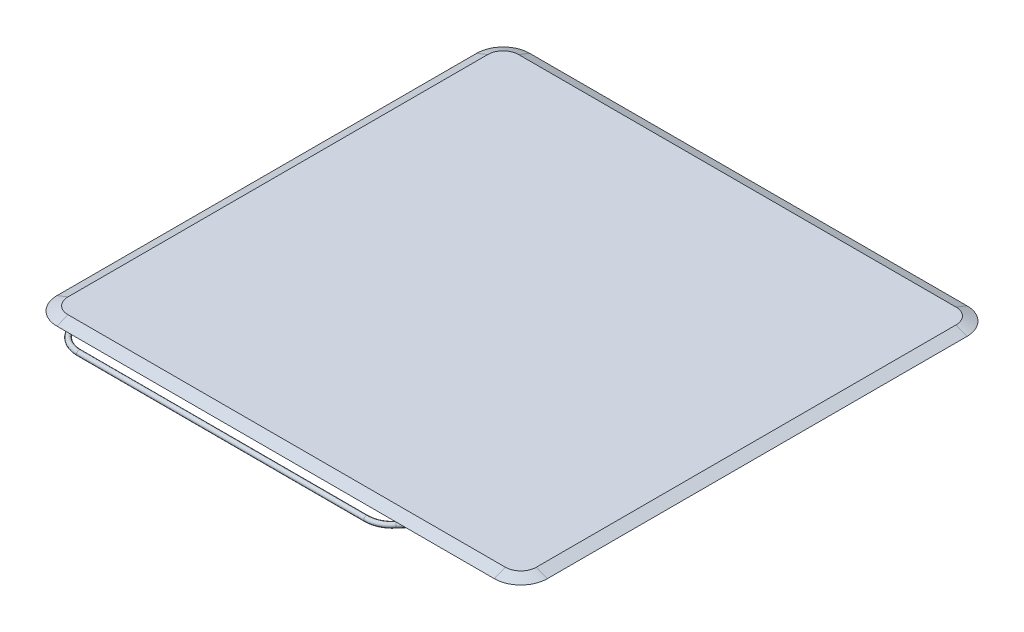
ISO-10303-21;
HEADER;
FILE_DESCRIPTION(('STEP AP214'),'2;1');
FILE_NAME('part.step','',(''),(''),'','','');
FILE_SCHEMA(('AUTOMOTIVE_DESIGN { 1 0 10303 214 1 1 1 1 }'));
ENDSEC;
DATA;
#1=APPLICATION_CONTEXT('core data for automotive mechanical design processes');
#2=APPLICATION_PROTOCOL_DEFINITION('international standard','automotive_design',2000,#1);
#3=PRODUCT_CONTEXT('',#1,'mechanical');
#4=PRODUCT('Part','Part','',(#3));
#5=PRODUCT_RELATED_PRODUCT_CATEGORY('part','',(#4));
#6=PRODUCT_DEFINITION_FORMATION('','',#4);
#7=PRODUCT_DEFINITION_CONTEXT('part definition',#1,'design');
#8=PRODUCT_DEFINITION('design','',#6,#7);
#9=PRODUCT_DEFINITION_SHAPE('','',#8);
#10=(LENGTH_UNIT() NAMED_UNIT(*) SI_UNIT(.MILLI.,.METRE.));
#11=(NAMED_UNIT(*) PLANE_ANGLE_UNIT() SI_UNIT($,.RADIAN.));
#12=(NAMED_UNIT(*) SI_UNIT($,.STERADIAN.) SOLID_ANGLE_UNIT());
#13=UNCERTAINTY_MEASURE_WITH_UNIT(LENGTH_MEASURE(1.E-05),#10,'distance_accuracy_value','');
#14=(GEOMETRIC_REPRESENTATION_CONTEXT(3) GLOBAL_UNCERTAINTY_ASSIGNED_CONTEXT((#13)) GLOBAL_UNIT_ASSIGNED_CONTEXT((#10,
#11,#12)) REPRESENTATION_CONTEXT('',''));
#15=CARTESIAN_POINT('',(0.,0.,0.));
#16=DIRECTION('',(0.,0.,1.));
#17=DIRECTION('',(1.,0.,0.));
#18=AXIS2_PLACEMENT_3D('',#15,#16,#17);
#19=CARTESIAN_POINT('',(0.,28.1999999999998,0.));
#20=DIRECTION('',(0.,1.,0.));
#21=DIRECTION('',(0.,0.,1.));
#22=AXIS2_PLACEMENT_3D('',#19,#20,#21);
#23=PLANE('',#22);
#24=DIRECTION('',(1.,0.,0.));
#25=VECTOR('',#24,1.);
#26=CARTESIAN_POINT('',(-49.5,28.2,51.));
#27=LINE('',#26,#25);
#28=CARTESIAN_POINT('',(49.5,28.2,51.));
#29=VERTEX_POINT('',#28);
#30=CARTESIAN_POINT('',(-49.5,28.2,51.));
#31=VERTEX_POINT('',#30);
#32=EDGE_CURVE('P0_E182',#29,#31,#27,.F.);
#33=ORIENTED_EDGE('',*,*,#32,.F.);
#34=CARTESIAN_POINT('',(49.5,28.2,51.));
#35=CARTESIAN_POINT('',(50.02138239889,28.2,51.));
#36=CARTESIAN_POINT('',(50.96242475965,28.2,50.77305553846));
#37=CARTESIAN_POINT('',(52.0284405267,28.2,50.0284405267));
#38=CARTESIAN_POINT('',(52.77305553846,28.2,48.96242475965));
#39=CARTESIAN_POINT('',(53.,28.2,48.02138239889));
#40=CARTESIAN_POINT('',(53.,28.2,47.5));
#41=B_SPLINE_CURVE_WITH_KNOTS('',3,(#34,#35,#36,#37,#38,#39,#40),.UNSPECIFIED.,.F.,.F.,(4,1,1,1,
4),(0.7547881540646,0.7592317860314,0.7636754179983,0.7681190499652,0.772562681932),.UNSPECIFIED.);
#42=CARTESIAN_POINT('',(52.9999999999997,28.1999999999991,47.5));
#43=VERTEX_POINT('',#42);
#44=EDGE_CURVE('P0_E201',#43,#29,#41,.F.);
#45=ORIENTED_EDGE('',*,*,#44,.F.);
#46=DIRECTION('',(0.,0.,1.));
#47=VECTOR('',#46,1.);
#48=CARTESIAN_POINT('',(53.,28.2,47.5));
#49=LINE('',#48,#47);
#50=CARTESIAN_POINT('',(53.,28.2,-47.5));
#51=VERTEX_POINT('',#50);
#52=EDGE_CURVE('P0_E82',#51,#43,#49,.T.);
#53=ORIENTED_EDGE('',*,*,#52,.F.);
#54=CARTESIAN_POINT('',(53.,28.2,-47.5));
#55=CARTESIAN_POINT('',(53.,28.2,-48.02138239889));
#56=CARTESIAN_POINT('',(52.77305553846,28.2,-48.96242475965));
#57=CARTESIAN_POINT('',(52.0284405267,28.2,-50.0284405267));
#58=CARTESIAN_POINT('',(50.96242475965,28.2,-50.77305553846));
#59=CARTESIAN_POINT('',(50.02138239889,28.2,-51.));
#60=CARTESIAN_POINT('',(49.5,28.2,-51.));
#61=B_SPLINE_CURVE_WITH_KNOTS('',3,(#54,#55,#56,#57,#58,#59,#60),.UNSPECIFIED.,.F.,.F.,(4,1,1,1,
4),(0.,0.004443631966857,0.008887263933714,0.01333089590057,0.01777452786743),.UNSPECIFIED.);
#62=CARTESIAN_POINT('',(49.5,28.1999999999991,-50.9999999999997));
#63=VERTEX_POINT('',#62);
#64=EDGE_CURVE('P0_E77',#63,#51,#61,.F.);
#65=ORIENTED_EDGE('',*,*,#64,.F.);
#66=DIRECTION('',(1.,0.,0.));
#67=VECTOR('',#66,1.);
#68=CARTESIAN_POINT('',(49.5,28.2,-51.));
#69=LINE('',#68,#67);
#70=CARTESIAN_POINT('',(-49.5,28.1999999999991,-50.9999999999997));
#71=VERTEX_POINT('',#70);
#72=EDGE_CURVE('P0_E79',#71,#63,#69,.T.);
#73=ORIENTED_EDGE('',*,*,#72,.F.);
#74=CARTESIAN_POINT('',(-49.5,28.2,-51.));
#75=CARTESIAN_POINT('',(-50.02138239889,28.2,-51.));
#76=CARTESIAN_POINT('',(-50.96242475965,28.2,-50.77305553846));
#77=CARTESIAN_POINT('',(-52.0284405267,28.2,-50.0284405267));
#78=CARTESIAN_POINT('',(-52.77305553846,28.2,-48.96242475965));
#79=CARTESIAN_POINT('',(-53.,28.2,-48.02138239889));
#80=CARTESIAN_POINT('',(-53.,28.2,-47.5));
#81=B_SPLINE_CURVE_WITH_KNOTS('',3,(#74,#75,#76,#77,#78,#79,#80),.UNSPECIFIED.,.F.,.F.,(4,1,1,1,
4),(0.2547881540646,0.2592317860314,0.2636754179983,0.2681190499652,0.272562681932),.UNSPECIFIED.);
#82=CARTESIAN_POINT('',(-53.,28.2,-47.5));
#83=VERTEX_POINT('',#82);
#84=EDGE_CURVE('P0_E117',#83,#71,#81,.F.);
#85=ORIENTED_EDGE('',*,*,#84,.F.);
#86=DIRECTION('',(0.,0.,1.));
#87=VECTOR('',#86,1.);
#88=CARTESIAN_POINT('',(-53.,28.2,-47.5));
#89=LINE('',#88,#87);
#90=CARTESIAN_POINT('',(-52.9999999999997,28.1999999999991,47.5));
#91=VERTEX_POINT('',#90);
#92=EDGE_CURVE('P0_E102',#91,#83,#89,.F.);
#93=ORIENTED_EDGE('',*,*,#92,.F.);
#94=CARTESIAN_POINT('',(-53.,28.2,47.5));
#95=CARTESIAN_POINT('',(-53.,28.2,48.02138239889));
#96=CARTESIAN_POINT('',(-52.77305553846,28.2,48.96242475965));
#97=CARTESIAN_POINT('',(-52.0284405267,28.2,50.0284405267));
#98=CARTESIAN_POINT('',(-50.96242475965,28.2,50.77305553846));
#99=CARTESIAN_POINT('',(-50.02138239889,28.2,51.));
#100=CARTESIAN_POINT('',(-49.5,28.2,51.));
#101=B_SPLINE_CURVE_WITH_KNOTS('',3,(#94,#95,#96,#97,#98,#99,#100),.UNSPECIFIED.,.F.,.F.,(4,1,1,
1,4),(0.5,0.5044436319669,0.5088872639337,0.5133308959006,0.5177745278674),.UNSPECIFIED.);
#102=EDGE_CURVE('P0_E156',#31,#91,#101,.F.);
#103=ORIENTED_EDGE('',*,*,#102,.F.);
#104=EDGE_LOOP('',(#33,#45,#53,#65,#73,#85,#93,#103));
#105=FACE_BOUND('',#104,.T.);
#106=ADVANCED_FACE('P0_F16',(#105),#23,.T.);
#107=CARTESIAN_POINT('',(0.,27.1999999999998,0.));
#108=DIRECTION('',(0.,1.,0.));
#109=DIRECTION('',(0.,0.,1.));
#110=AXIS2_PLACEMENT_3D('',#107,#108,#109);
#111=PLANE('',#110);
#112=CARTESIAN_POINT('',(-55.5,27.2,47.5));
#113=CARTESIAN_POINT('',(-55.5,27.2,48.18681270747));
#114=CARTESIAN_POINT('',(-55.25347444083,27.2,49.71651575259));
#115=CARTESIAN_POINT('',(-53.87146348232,27.2,51.87146348232));
#116=CARTESIAN_POINT('',(-51.71651575259,27.2,53.25347444083));
#117=CARTESIAN_POINT('',(-50.18681270747,27.2,53.5));
#118=CARTESIAN_POINT('',(-49.5,27.2,53.5));
#119=B_SPLINE_CURVE_WITH_KNOTS('',3,(#112,#113,#114,#115,#116,#117,#118),.UNSPECIFIED.,.F.,.F.,
(4,1,1,1,4),(0.5,0.5044436319669,0.5088872639337,0.5133308959006,0.5177745278674),.UNSPECIFIED.);
#120=CARTESIAN_POINT('',(-55.5000000000014,27.2000000000004,47.5));
#121=VERTEX_POINT('',#120);
#122=CARTESIAN_POINT('',(-49.5,27.2,53.5));
#123=VERTEX_POINT('',#122);
#124=EDGE_CURVE('P0_E165',#121,#123,#119,.T.);
#125=ORIENTED_EDGE('',*,*,#124,.F.);
#126=DIRECTION('',(0.,0.,1.));
#127=VECTOR('',#126,1.);
#128=CARTESIAN_POINT('',(-55.5,27.2,-47.5));
#129=LINE('',#128,#127);
#130=CARTESIAN_POINT('',(-55.5,27.2,-47.5));
#131=VERTEX_POINT('',#130);
#132=EDGE_CURVE('P0_E130',#131,#121,#129,.T.);
#133=ORIENTED_EDGE('',*,*,#132,.F.);
#134=CARTESIAN_POINT('',(-49.5,27.2,-53.5));
#135=CARTESIAN_POINT('',(-50.18681270747,27.2,-53.5));
#136=CARTESIAN_POINT('',(-51.71651575259,27.2,-53.25347444083));
#137=CARTESIAN_POINT('',(-53.87146348232,27.2,-51.87146348232));
#138=CARTESIAN_POINT('',(-55.25347444083,27.2,-49.71651575259));
#139=CARTESIAN_POINT('',(-55.5,27.2,-48.18681270747));
#140=CARTESIAN_POINT('',(-55.5,27.2,-47.5));
#141=B_SPLINE_CURVE_WITH_KNOTS('',3,(#134,#135,#136,#137,#138,#139,#140),.UNSPECIFIED.,.F.,.F.,
(4,1,1,1,4),(0.2547881540646,0.2592317860314,0.2636754179983,0.2681190499652,0.272562681932),.UNSPECIFIED.);
#142=CARTESIAN_POINT('',(-49.5,27.2000000000004,-53.5000000000014));
#143=VERTEX_POINT('',#142);
#144=EDGE_CURVE('P0_E88',#143,#131,#141,.T.);
#145=ORIENTED_EDGE('',*,*,#144,.F.);
#146=DIRECTION('',(1.,0.,0.));
#147=VECTOR('',#146,1.);
#148=CARTESIAN_POINT('',(49.5,27.2,-53.5));
#149=LINE('',#148,#147);
#150=CARTESIAN_POINT('',(49.5,27.2000000000009,-53.5000000000003));
#151=VERTEX_POINT('',#150);
#152=EDGE_CURVE('P0_E99',#151,#143,#149,.F.);
#153=ORIENTED_EDGE('',*,*,#152,.F.);
#154=CARTESIAN_POINT('',(55.5,27.2,-47.5));
#155=CARTESIAN_POINT('',(55.5,27.2,-48.18681270747));
#156=CARTESIAN_POINT('',(55.25347444083,27.2,-49.71651575259));
#157=CARTESIAN_POINT('',(53.87146348232,27.2,-51.87146348232));
#158=CARTESIAN_POINT('',(51.71651575259,27.2,-53.25347444083));
#159=CARTESIAN_POINT('',(50.18681270747,27.2,-53.5));
#160=CARTESIAN_POINT('',(49.5,27.2,-53.5));
#161=B_SPLINE_CURVE_WITH_KNOTS('',3,(#154,#155,#156,#157,#158,#159,#160),.UNSPECIFIED.,.F.,.F.,
(4,1,1,1,4),(0.,0.004443631966857,0.008887263933714,0.01333089590057,0.01777452786743),.UNSPECIFIED.);
#162=CARTESIAN_POINT('',(55.5000000000011,27.1999999999996,-47.5));
#163=VERTEX_POINT('',#162);
#164=EDGE_CURVE('P0_E87',#163,#151,#161,.T.);
#165=ORIENTED_EDGE('',*,*,#164,.F.);
#166=DIRECTION('',(0.,0.,1.));
#167=VECTOR('',#166,1.);
#168=CARTESIAN_POINT('',(55.5,27.2,47.5));
#169=LINE('',#168,#167);
#170=CARTESIAN_POINT('',(55.5000000000003,27.2000000000009,47.5));
#171=VERTEX_POINT('',#170);
#172=EDGE_CURVE('P0_E157',#171,#163,#169,.F.);
#173=ORIENTED_EDGE('',*,*,#172,.F.);
#174=CARTESIAN_POINT('',(49.5,27.2,53.5));
#175=CARTESIAN_POINT('',(50.18681270747,27.2,53.5));
#176=CARTESIAN_POINT('',(51.71651575259,27.2,53.25347444083));
#177=CARTESIAN_POINT('',(53.87146348232,27.2,51.87146348232));
#178=CARTESIAN_POINT('',(55.25347444083,27.2,49.71651575259));
#179=CARTESIAN_POINT('',(55.5,27.2,48.18681270747));
#180=CARTESIAN_POINT('',(55.5,27.2,47.5));
#181=B_SPLINE_CURVE_WITH_KNOTS('',3,(#174,#175,#176,#177,#178,#179,#180),.UNSPECIFIED.,.F.,.F.,
(4,1,1,1,4),(0.7547881540646,0.7592317860314,0.7636754179983,0.7681190499652,0.772562681932),.UNSPECIFIED.);
#182=CARTESIAN_POINT('',(49.5,27.1999999999996,53.5000000000011));
#183=VERTEX_POINT('',#182);
#184=EDGE_CURVE('P0_E34',#183,#171,#181,.T.);
#185=ORIENTED_EDGE('',*,*,#184,.F.);
#186=DIRECTION('',(1.,0.,0.));
#187=VECTOR('',#186,1.);
#188=CARTESIAN_POINT('',(-49.5,27.2,53.5));
#189=LINE('',#188,#187);
#190=EDGE_CURVE('P0_E25',#123,#183,#189,.T.);
#191=ORIENTED_EDGE('',*,*,#190,.F.);
#192=EDGE_LOOP('',(#125,#133,#145,#153,#165,#173,#185,#191));
#193=FACE_BOUND('',#192,.T.);
#194=ADVANCED_FACE('P0_F244',(#193),#111,.F.);
#195=CARTESIAN_POINT('',(49.5,28.2,-51.));
#196=DIRECTION('',(0.,0.928476690885259,-0.371390676354105));
#197=DIRECTION('',(0.,0.371390676354105,0.928476690885259));
#198=AXIS2_PLACEMENT_3D('',#195,#196,#197);
#199=PLANE('',#198);
#200=ORIENTED_EDGE('',*,*,#152,.T.);
#201=DIRECTION('',(0.,-0.371390676352184,-0.928476690886027));
#202=VECTOR('',#201,1.);
#203=CARTESIAN_POINT('',(-49.5,27.7,-52.25));
#204=LINE('',#203,#202);
#205=EDGE_CURVE('P0_E97',#71,#143,#204,.T.);
#206=ORIENTED_EDGE('',*,*,#205,.F.);
#207=ORIENTED_EDGE('',*,*,#72,.T.);
#208=DIRECTION('',(0.,0.371390676352184,0.928476690886027));
#209=VECTOR('',#208,1.);
#210=CARTESIAN_POINT('',(49.5,27.7,-52.25));
#211=LINE('',#210,#209);
#212=EDGE_CURVE('P0_E94',#151,#63,#211,.T.);
#213=ORIENTED_EDGE('',*,*,#212,.F.);
#214=EDGE_LOOP('',(#200,#206,#207,#213));
#215=FACE_BOUND('',#214,.T.);
#216=ADVANCED_FACE('P0_F93',(#215),#199,.T.);
#217=CARTESIAN_POINT('',(-49.5,28.2,-51.));
#218=CARTESIAN_POINT('',(-50.02138239889,28.2,-51.));
#219=CARTESIAN_POINT('',(-50.96242475965,28.2,-50.77305553846));
#220=CARTESIAN_POINT('',(-52.0284405267,28.2,-50.0284405267));
#221=CARTESIAN_POINT('',(-52.77305553846,28.2,-48.96242475965));
#222=CARTESIAN_POINT('',(-53.,28.2,-48.02138239889));
#223=CARTESIAN_POINT('',(-53.,28.2,-47.5));
#224=CARTESIAN_POINT('',(-49.5,27.86666666667,-51.83333333333));
#225=CARTESIAN_POINT('',(-50.07652583508,27.86666666667,-51.83333333333));
#226=CARTESIAN_POINT('',(-51.21378842396,27.86666666667,-51.59986183925));
#227=CARTESIAN_POINT('',(-52.64278151191,27.86666666667,-50.64278151191));
#228=CARTESIAN_POINT('',(-53.59986183925,27.86666666667,-49.21378842396));
#229=CARTESIAN_POINT('',(-53.83333333333,27.86666666667,-48.07652583508));
#230=CARTESIAN_POINT('',(-53.83333333333,27.86666666667,-47.5));
#231=CARTESIAN_POINT('',(-49.5,27.53333333333,-52.66666666667));
#232=CARTESIAN_POINT('',(-50.13166927128,27.53333333333,-52.66666666667));
#233=CARTESIAN_POINT('',(-51.46515208828,27.53333333333,-52.42666814004));
#234=CARTESIAN_POINT('',(-53.25712249712,27.53333333333,-51.25712249712));
#235=CARTESIAN_POINT('',(-54.42666814004,27.53333333333,-49.46515208828));
#236=CARTESIAN_POINT('',(-54.66666666667,27.53333333333,-48.13166927128));
#237=CARTESIAN_POINT('',(-54.66666666667,27.53333333333,-47.5));
#238=CARTESIAN_POINT('',(-49.5,27.2,-53.5));
#239=CARTESIAN_POINT('',(-50.18681270747,27.2,-53.5));
#240=CARTESIAN_POINT('',(-51.71651575259,27.2,-53.25347444083));
#241=CARTESIAN_POINT('',(-53.87146348232,27.2,-51.87146348232));
#242=CARTESIAN_POINT('',(-55.25347444083,27.2,-49.71651575259));
#243=CARTESIAN_POINT('',(-55.5,27.2,-48.18681270747));
#244=CARTESIAN_POINT('',(-55.5,27.2,-47.5));
#245=B_SPLINE_SURFACE_WITH_KNOTS('',3,3,((#217,#218,#219,#220,#221,#222,#223),(#224,#225,#226,
#227,#228,#229,#230),(#231,#232,#233,#234,#235,#236,#237),(#238,#239,#240,#241,#242,#243,#244)),
.UNSPECIFIED.,.F.,.F.,.F.,(4,4),(4,1,1,1,4),(0.,1.),(0.2547881540646,0.2592317860314,
0.2636754179983,0.2681190499652,0.272562681932),.UNSPECIFIED.);
#246=DIRECTION('',(-0.928476690885259,-0.371390676354104,0.));
#247=VECTOR('',#246,1.);
#248=CARTESIAN_POINT('',(-53.,28.2,-47.5));
#249=LINE('',#248,#247);
#250=EDGE_CURVE('P0_E105',#83,#131,#249,.T.);
#251=ORIENTED_EDGE('',*,*,#144,.T.);
#252=ORIENTED_EDGE('',*,*,#250,.F.);
#253=ORIENTED_EDGE('',*,*,#84,.T.);
#254=ORIENTED_EDGE('',*,*,#205,.T.);
#255=EDGE_LOOP('',(#251,#252,#253,#254));
#256=FACE_BOUND('',#255,.T.);
#257=ADVANCED_FACE('P0_F245',(#256),#245,.T.);
#258=CARTESIAN_POINT('',(53.,28.2,-47.5));
#259=CARTESIAN_POINT('',(53.,28.2,-48.02138239889));
#260=CARTESIAN_POINT('',(52.77305553846,28.2,-48.96242475965));
#261=CARTESIAN_POINT('',(52.0284405267,28.2,-50.0284405267));
#262=CARTESIAN_POINT('',(50.96242475965,28.2,-50.77305553846));
#263=CARTESIAN_POINT('',(50.02138239889,28.2,-51.));
#264=CARTESIAN_POINT('',(49.5,28.2,-51.));
#265=CARTESIAN_POINT('',(53.83333333333,27.86666666667,-47.5));
#266=CARTESIAN_POINT('',(53.83333333333,27.86666666667,-48.07652583508));
#267=CARTESIAN_POINT('',(53.59986183925,27.86666666667,-49.21378842396));
#268=CARTESIAN_POINT('',(52.64278151191,27.86666666667,-50.64278151191));
#269=CARTESIAN_POINT('',(51.21378842396,27.86666666667,-51.59986183925));
#270=CARTESIAN_POINT('',(50.07652583508,27.86666666667,-51.83333333333));
#271=CARTESIAN_POINT('',(49.5,27.86666666667,-51.83333333333));
#272=CARTESIAN_POINT('',(54.66666666667,27.53333333333,-47.5));
#273=CARTESIAN_POINT('',(54.66666666667,27.53333333333,-48.13166927128));
#274=CARTESIAN_POINT('',(54.42666814004,27.53333333333,-49.46515208828));
#275=CARTESIAN_POINT('',(53.25712249712,27.53333333333,-51.25712249712));
#276=CARTESIAN_POINT('',(51.46515208828,27.53333333333,-52.42666814004));
#277=CARTESIAN_POINT('',(50.13166927128,27.53333333333,-52.66666666667));
#278=CARTESIAN_POINT('',(49.5,27.53333333333,-52.66666666667));
#279=CARTESIAN_POINT('',(55.5,27.2,-47.5));
#280=CARTESIAN_POINT('',(55.5,27.2,-48.18681270747));
#281=CARTESIAN_POINT('',(55.25347444083,27.2,-49.71651575259));
#282=CARTESIAN_POINT('',(53.87146348232,27.2,-51.87146348232));
#283=CARTESIAN_POINT('',(51.71651575259,27.2,-53.25347444083));
#284=CARTESIAN_POINT('',(50.18681270747,27.2,-53.5));
#285=CARTESIAN_POINT('',(49.5,27.2,-53.5));
#286=B_SPLINE_SURFACE_WITH_KNOTS('',3,3,((#258,#259,#260,#261,#262,#263,#264),(#265,#266,#267,
#268,#269,#270,#271),(#272,#273,#274,#275,#276,#277,#278),(#279,#280,#281,#282,#283,#284,#285)),
.UNSPECIFIED.,.F.,.F.,.F.,(4,4),(4,1,1,1,4),(0.,1.),(0.,0.004443631966857,0.008887263933714,
0.01333089590057,0.01777452786743),.UNSPECIFIED.);
#287=DIRECTION('',(-0.928476690885259,0.371390676354104,0.));
#288=VECTOR('',#287,1.);
#289=CARTESIAN_POINT('',(53.,28.2,-47.5));
#290=LINE('',#289,#288);
#291=EDGE_CURVE('P0_E154',#163,#51,#290,.T.);
#292=ORIENTED_EDGE('',*,*,#164,.T.);
#293=ORIENTED_EDGE('',*,*,#212,.T.);
#294=ORIENTED_EDGE('',*,*,#64,.T.);
#295=ORIENTED_EDGE('',*,*,#291,.F.);
#296=EDGE_LOOP('',(#292,#293,#294,#295));
#297=FACE_BOUND('',#296,.T.);
#298=ADVANCED_FACE('P0_F101',(#297),#286,.T.);
#299=CARTESIAN_POINT('',(-53.,28.2,-47.5));
#300=DIRECTION('',(-0.371390676354104,0.928476690885259,0.));
#301=DIRECTION('',(-0.928476690885259,-0.371390676354104,0.));
#302=AXIS2_PLACEMENT_3D('',#299,#300,#301);
#303=PLANE('',#302);
#304=ORIENTED_EDGE('',*,*,#132,.T.);
#305=DIRECTION('',(-0.928476690886027,-0.371390676352184,0.));
#306=VECTOR('',#305,1.);
#307=CARTESIAN_POINT('',(-54.25,27.7,47.5));
#308=LINE('',#307,#306);
#309=EDGE_CURVE('P0_E162',#91,#121,#308,.T.);
#310=ORIENTED_EDGE('',*,*,#309,.F.);
#311=ORIENTED_EDGE('',*,*,#92,.T.);
#312=ORIENTED_EDGE('',*,*,#250,.T.);
#313=EDGE_LOOP('',(#304,#310,#311,#312));
#314=FACE_BOUND('',#313,.T.);
#315=ADVANCED_FACE('P0_F247',(#314),#303,.T.);
#316=CARTESIAN_POINT('',(53.,28.2,47.5));
#317=DIRECTION('',(0.371390676354104,0.928476690885259,0.));
#318=DIRECTION('',(-0.928476690885259,0.371390676354104,0.));
#319=AXIS2_PLACEMENT_3D('',#316,#317,#318);
#320=PLANE('',#319);
#321=ORIENTED_EDGE('',*,*,#172,.T.);
#322=ORIENTED_EDGE('',*,*,#291,.T.);
#323=ORIENTED_EDGE('',*,*,#52,.T.);
#324=DIRECTION('',(-0.928476690886027,0.371390676352184,0.));
#325=VECTOR('',#324,1.);
#326=CARTESIAN_POINT('',(54.25,27.7,47.5));
#327=LINE('',#326,#325);
#328=EDGE_CURVE('P0_E179',#171,#43,#327,.T.);
#329=ORIENTED_EDGE('',*,*,#328,.F.);
#330=EDGE_LOOP('',(#321,#322,#323,#329));
#331=FACE_BOUND('',#330,.T.);
#332=ADVANCED_FACE('P0_F243',(#331),#320,.T.);
#333=CARTESIAN_POINT('',(-53.,28.2,47.5));
#334=CARTESIAN_POINT('',(-53.,28.2,48.02138239889));
#335=CARTESIAN_POINT('',(-52.77305553846,28.2,48.96242475965));
#336=CARTESIAN_POINT('',(-52.0284405267,28.2,50.0284405267));
#337=CARTESIAN_POINT('',(-50.96242475965,28.2,50.77305553846));
#338=CARTESIAN_POINT('',(-50.02138239889,28.2,51.));
#339=CARTESIAN_POINT('',(-49.5,28.2,51.));
#340=CARTESIAN_POINT('',(-53.83333333333,27.86666666667,47.5));
#341=CARTESIAN_POINT('',(-53.83333333333,27.86666666667,48.07652583508));
#342=CARTESIAN_POINT('',(-53.59986183925,27.86666666667,49.21378842396));
#343=CARTESIAN_POINT('',(-52.64278151191,27.86666666667,50.64278151191));
#344=CARTESIAN_POINT('',(-51.21378842396,27.86666666667,51.59986183925));
#345=CARTESIAN_POINT('',(-50.07652583508,27.86666666667,51.83333333333));
#346=CARTESIAN_POINT('',(-49.5,27.86666666667,51.83333333333));
#347=CARTESIAN_POINT('',(-54.66666666667,27.53333333333,47.5));
#348=CARTESIAN_POINT('',(-54.66666666667,27.53333333333,48.13166927128));
#349=CARTESIAN_POINT('',(-54.42666814004,27.53333333333,49.46515208828));
#350=CARTESIAN_POINT('',(-53.25712249712,27.53333333333,51.25712249712));
#351=CARTESIAN_POINT('',(-51.46515208828,27.53333333333,52.42666814004));
#352=CARTESIAN_POINT('',(-50.13166927128,27.53333333333,52.66666666667));
#353=CARTESIAN_POINT('',(-49.5,27.53333333333,52.66666666667));
#354=CARTESIAN_POINT('',(-55.5,27.2,47.5));
#355=CARTESIAN_POINT('',(-55.5,27.2,48.18681270747));
#356=CARTESIAN_POINT('',(-55.25347444083,27.2,49.71651575259));
#357=CARTESIAN_POINT('',(-53.87146348232,27.2,51.87146348232));
#358=CARTESIAN_POINT('',(-51.71651575259,27.2,53.25347444083));
#359=CARTESIAN_POINT('',(-50.18681270747,27.2,53.5));
#360=CARTESIAN_POINT('',(-49.5,27.2,53.5));
#361=B_SPLINE_SURFACE_WITH_KNOTS('',3,3,((#333,#334,#335,#336,#337,#338,#339),(#340,#341,#342,
#343,#344,#345,#346),(#347,#348,#349,#350,#351,#352,#353),(#354,#355,#356,#357,#358,#359,#360)),
.UNSPECIFIED.,.F.,.F.,.F.,(4,4),(4,1,1,1,4),(0.,1.),(0.5,0.5044436319669,0.5088872639337,
0.5133308959006,0.5177745278674),.UNSPECIFIED.);
#362=DIRECTION('',(0.,-0.371390676354105,0.928476690885259));
#363=VECTOR('',#362,1.);
#364=CARTESIAN_POINT('',(-49.5,28.2,51.));
#365=LINE('',#364,#363);
#366=EDGE_CURVE('P0_E196',#31,#123,#365,.T.);
#367=ORIENTED_EDGE('',*,*,#124,.T.);
#368=ORIENTED_EDGE('',*,*,#366,.F.);
#369=ORIENTED_EDGE('',*,*,#102,.T.);
#370=ORIENTED_EDGE('',*,*,#309,.T.);
#371=EDGE_LOOP('',(#367,#368,#369,#370));
#372=FACE_BOUND('',#371,.T.);
#373=ADVANCED_FACE('P0_F235',(#372),#361,.T.);
#374=CARTESIAN_POINT('',(49.5,28.2,51.));
#375=CARTESIAN_POINT('',(50.02138239889,28.2,51.));
#376=CARTESIAN_POINT('',(50.96242475965,28.2,50.77305553846));
#377=CARTESIAN_POINT('',(52.0284405267,28.2,50.0284405267));
#378=CARTESIAN_POINT('',(52.77305553846,28.2,48.96242475965));
#379=CARTESIAN_POINT('',(53.,28.2,48.02138239889));
#380=CARTESIAN_POINT('',(53.,28.2,47.5));
#381=CARTESIAN_POINT('',(49.5,27.86666666667,51.83333333333));
#382=CARTESIAN_POINT('',(50.07652583508,27.86666666667,51.83333333333));
#383=CARTESIAN_POINT('',(51.21378842396,27.86666666667,51.59986183925));
#384=CARTESIAN_POINT('',(52.64278151191,27.86666666667,50.64278151191));
#385=CARTESIAN_POINT('',(53.59986183925,27.86666666667,49.21378842396));
#386=CARTESIAN_POINT('',(53.83333333333,27.86666666667,48.07652583508));
#387=CARTESIAN_POINT('',(53.83333333333,27.86666666667,47.5));
#388=CARTESIAN_POINT('',(49.5,27.53333333333,52.66666666667));
#389=CARTESIAN_POINT('',(50.13166927128,27.53333333333,52.66666666667));
#390=CARTESIAN_POINT('',(51.46515208828,27.53333333333,52.42666814004));
#391=CARTESIAN_POINT('',(53.25712249712,27.53333333333,51.25712249712));
#392=CARTESIAN_POINT('',(54.42666814004,27.53333333333,49.46515208828));
#393=CARTESIAN_POINT('',(54.66666666667,27.53333333333,48.13166927128));
#394=CARTESIAN_POINT('',(54.66666666667,27.53333333333,47.5));
#395=CARTESIAN_POINT('',(49.5,27.2,53.5));
#396=CARTESIAN_POINT('',(50.18681270747,27.2,53.5));
#397=CARTESIAN_POINT('',(51.71651575259,27.2,53.25347444083));
#398=CARTESIAN_POINT('',(53.87146348232,27.2,51.87146348232));
#399=CARTESIAN_POINT('',(55.25347444083,27.2,49.71651575259));
#400=CARTESIAN_POINT('',(55.5,27.2,48.18681270747));
#401=CARTESIAN_POINT('',(55.5,27.2,47.5));
#402=B_SPLINE_SURFACE_WITH_KNOTS('',3,3,((#374,#375,#376,#377,#378,#379,#380),(#381,#382,#383,
#384,#385,#386,#387),(#388,#389,#390,#391,#392,#393,#394),(#395,#396,#397,#398,#399,#400,#401)),
.UNSPECIFIED.,.F.,.F.,.F.,(4,4),(4,1,1,1,4),(0.,1.),(0.7547881540646,0.7592317860314,
0.7636754179983,0.7681190499652,0.772562681932),.UNSPECIFIED.);
#403=DIRECTION('',(0.,-0.371390676354105,0.928476690885259));
#404=VECTOR('',#403,1.);
#405=CARTESIAN_POINT('',(49.5,28.2,51.));
#406=LINE('',#405,#404);
#407=EDGE_CURVE('P0_E11',#183,#29,#406,.F.);
#408=ORIENTED_EDGE('',*,*,#184,.T.);
#409=ORIENTED_EDGE('',*,*,#328,.T.);
#410=ORIENTED_EDGE('',*,*,#44,.T.);
#411=ORIENTED_EDGE('',*,*,#407,.F.);
#412=EDGE_LOOP('',(#408,#409,#410,#411));
#413=FACE_BOUND('',#412,.T.);
#414=ADVANCED_FACE('P0_F240',(#413),#402,.T.);
#415=CARTESIAN_POINT('',(-49.5,28.2,51.));
#416=DIRECTION('',(0.,0.928476690885259,0.371390676354105));
#417=DIRECTION('',(0.,-0.371390676354105,0.928476690885259));
#418=AXIS2_PLACEMENT_3D('',#415,#416,#417);
#419=PLANE('',#418);
#420=ORIENTED_EDGE('',*,*,#190,.T.);
#421=ORIENTED_EDGE('',*,*,#407,.T.);
#422=ORIENTED_EDGE('',*,*,#32,.T.);
#423=ORIENTED_EDGE('',*,*,#366,.T.);
#424=EDGE_LOOP('',(#420,#421,#422,#423));
#425=FACE_BOUND('',#424,.T.);
#426=ADVANCED_FACE('P0_F238',(#425),#419,.T.);
#427=CLOSED_SHELL('',(#106,#194,#216,#257,#298,#315,#332,#373,#414,#426));
#428=MANIFOLD_SOLID_BREP('P0_B1',#427);
#429=CARTESIAN_POINT('',(-25.85995849236,27.83852579205,-50.23801677377));
#430=DIRECTION('',(0.,-0.673157240062923,0.739499378059825));
#431=DIRECTION('',(0.,-0.739499378059825,-0.673157240062923));
#432=AXIS2_PLACEMENT_3D('',#429,#430,#431);
#433=PLANE('',#432);
#434=DIRECTION('',(0.,-0.739499378059825,-0.673157240062923));
#435=VECTOR('',#434,1.);
#436=CARTESIAN_POINT('',(-25.85995849236,27.83852579205,-50.23801677377));
#437=LINE('',#436,#435);
#438=CARTESIAN_POINT('',(-25.85995849236,27.83852579205,-50.23801677377));
#439=VERTEX_POINT('',#438);
#440=CARTESIAN_POINT('',(-25.85995849236,26.0053413094861,-51.9139650613086));
#441=VERTEX_POINT('',#440);
#442=EDGE_CURVE('P1_E25',#439,#441,#437,.T.);
#443=ORIENTED_EDGE('',*,*,#442,.T.);
#444=DIRECTION('',(1.,0.,0.));
#445=VECTOR('',#444,1.);
#446=CARTESIAN_POINT('',(-25.85995849236,26.,-51.9116043178298));
#447=LINE('',#446,#445);
#448=CARTESIAN_POINT('',(25.85995849236,26.0053413094861,-51.9139650613086));
#449=VERTEX_POINT('',#448);
#450=EDGE_CURVE('P1_E11',#441,#449,#447,.T.);
#451=ORIENTED_EDGE('',*,*,#450,.T.);
#452=DIRECTION('',(0.,-0.739499378059825,-0.673157240062923));
#453=VECTOR('',#452,1.);
#454=CARTESIAN_POINT('',(25.85995849236,27.83852579205,-50.23801677377));
#455=LINE('',#454,#453);
#456=CARTESIAN_POINT('',(25.85995849236,27.83852579205,-50.23801677377));
#457=VERTEX_POINT('',#456);
#458=EDGE_CURVE('P1_E89',#449,#457,#455,.F.);
#459=ORIENTED_EDGE('',*,*,#458,.T.);
#460=DIRECTION('',(1.,0.,0.));
#461=VECTOR('',#460,1.);
#462=CARTESIAN_POINT('',(-25.85995849236,27.83852579205,-50.23801677377));
#463=LINE('',#462,#461);
#464=EDGE_CURVE('P1_E86',#457,#439,#463,.F.);
#465=ORIENTED_EDGE('',*,*,#464,.T.);
#466=EDGE_LOOP('',(#443,#451,#459,#465));
#467=FACE_BOUND('',#466,.T.);
#468=ADVANCED_FACE('P1_F16',(#467),#433,.T.);
#469=CARTESIAN_POINT('',(-25.85995849236,26.,-52.));
#470=DIRECTION('',(0.,-1.,0.));
#471=DIRECTION('',(0.,0.,-1.));
#472=AXIS2_PLACEMENT_3D('',#469,#470,#471);
#473=PLANE('',#472);
#474=DIRECTION('',(0.,0.,-1.));
#475=VECTOR('',#474,1.);
#476=CARTESIAN_POINT('',(-25.85995849236,26.,-52.));
#477=LINE('',#476,#475);
#478=CARTESIAN_POINT('',(-25.85995849236,26.,-52.5));
#479=VERTEX_POINT('',#478);
#480=EDGE_CURVE('P1_E103',#441,#479,#477,.T.);
#481=ORIENTED_EDGE('',*,*,#480,.T.);
#482=CARTESIAN_POINT('',(-25.85995849236,26.,-52.5));
#483=CARTESIAN_POINT('',(-25.85995849236,26.,-52.5940735361723));
#484=CARTESIAN_POINT('',(-25.8248526428912,26.,-52.6840473547809));
#485=CARTESIAN_POINT('',(-25.7881758290623,26.,-52.7780474443536));
#486=CARTESIAN_POINT('',(-25.7135118829533,26.,-52.8535533905933));
#487=CARTESIAN_POINT('',(-25.6427209871957,26.,-52.9251426093244));
#488=CARTESIAN_POINT('',(-25.544005847141,26.,-52.9648941505312));
#489=CARTESIAN_POINT('',(-25.4568273694809,26.,-53.));
#490=CARTESIAN_POINT('',(-25.35995849236,26.,-53.));
#491=B_SPLINE_CURVE_WITH_KNOTS('',2,(#482,#483,#484,#485,#486,#487,#488,#489,#490),
.UNSPECIFIED.,.F.,.F.,(3,2,2,2,3),(0.,0.25,0.5,0.75,1.),.UNSPECIFIED.);
#492=CARTESIAN_POINT('',(-25.35995849236,26.,-53.));
#493=VERTEX_POINT('',#492);
#494=EDGE_CURVE('P1_E70',#479,#493,#491,.T.);
#495=ORIENTED_EDGE('',*,*,#494,.T.);
#496=DIRECTION('',(1.,0.,0.));
#497=VECTOR('',#496,1.);
#498=CARTESIAN_POINT('',(-25.85995849236,26.,-53.));
#499=LINE('',#498,#497);
#500=CARTESIAN_POINT('',(-2.,26.,-53.));
#501=VERTEX_POINT('',#500);
#502=EDGE_CURVE('P1_E68',#493,#501,#499,.T.);
#503=ORIENTED_EDGE('',*,*,#502,.T.);
#504=DIRECTION('',(0.,0.,-1.));
#505=VECTOR('',#504,1.);
#506=CARTESIAN_POINT('',(-2.,26.,-52.));
#507=LINE('',#506,#505);
#508=CARTESIAN_POINT('',(-2.,26.,-52.45));
#509=VERTEX_POINT('',#508);
#510=EDGE_CURVE('P1_E65',#501,#509,#507,.F.);
#511=ORIENTED_EDGE('',*,*,#510,.T.);
#512=DIRECTION('',(1.,0.,0.));
#513=VECTOR('',#512,1.);
#514=CARTESIAN_POINT('',(-25.85995849236,26.,-52.45));
#515=LINE('',#514,#513);
#516=CARTESIAN_POINT('',(2.,26.,-52.45));
#517=VERTEX_POINT('',#516);
#518=EDGE_CURVE('P1_E74',#509,#517,#515,.T.);
#519=ORIENTED_EDGE('',*,*,#518,.T.);
#520=DIRECTION('',(0.,0.,-1.));
#521=VECTOR('',#520,1.);
#522=CARTESIAN_POINT('',(2.,26.,-52.));
#523=LINE('',#522,#521);
#524=CARTESIAN_POINT('',(2.,26.,-53.));
#525=VERTEX_POINT('',#524);
#526=EDGE_CURVE('P1_E58',#517,#525,#523,.T.);
#527=ORIENTED_EDGE('',*,*,#526,.T.);
#528=DIRECTION('',(1.,0.,0.));
#529=VECTOR('',#528,1.);
#530=CARTESIAN_POINT('',(-25.85995849236,26.,-53.));
#531=LINE('',#530,#529);
#532=CARTESIAN_POINT('',(25.35995849236,26.,-53.));
#533=VERTEX_POINT('',#532);
#534=EDGE_CURVE('P1_E52',#525,#533,#531,.T.);
#535=ORIENTED_EDGE('',*,*,#534,.T.);
#536=CARTESIAN_POINT('',(25.35995849236,26.,-53.));
#537=CARTESIAN_POINT('',(25.4540320285304,26.,-53.));
#538=CARTESIAN_POINT('',(25.5440058471409,26.,-52.9648941505312));
#539=CARTESIAN_POINT('',(25.6380059367108,26.,-52.9282173367041));
#540=CARTESIAN_POINT('',(25.7135118829533,26.,-52.8535533905933));
#541=CARTESIAN_POINT('',(25.7851011016858,26.,-52.7827624948351));
#542=CARTESIAN_POINT('',(25.8248526428912,26.,-52.6840473547809));
#543=CARTESIAN_POINT('',(25.85995849236,26.,-52.5968688771182));
#544=CARTESIAN_POINT('',(25.85995849236,26.,-52.5));
#545=B_SPLINE_CURVE_WITH_KNOTS('',2,(#536,#537,#538,#539,#540,#541,#542,#543,#544),
.UNSPECIFIED.,.F.,.F.,(3,2,2,2,3),(0.,0.25,0.5,0.75,1.),.UNSPECIFIED.);
#546=CARTESIAN_POINT('',(25.85995849236,26.,-52.5));
#547=VERTEX_POINT('',#546);
#548=EDGE_CURVE('P1_E112',#533,#547,#545,.T.);
#549=ORIENTED_EDGE('',*,*,#548,.T.);
#550=DIRECTION('',(0.,0.,-1.));
#551=VECTOR('',#550,1.);
#552=CARTESIAN_POINT('',(25.85995849236,26.,-52.));
#553=LINE('',#552,#551);
#554=EDGE_CURVE('P1_E108',#547,#449,#553,.F.);
#555=ORIENTED_EDGE('',*,*,#554,.T.);
#556=ORIENTED_EDGE('',*,*,#450,.F.);
#557=EDGE_LOOP('',(#481,#495,#503,#511,#519,#527,#535,#549,#555,#556));
#558=FACE_BOUND('',#557,.T.);
#559=ADVANCED_FACE('P1_F17',(#558),#473,.T.);
#560=OPEN_SHELL('',(#468,#559));
#561=SHELL_BASED_SURFACE_MODEL('P1_B1',(#560));
#562=CARTESIAN_POINT('',(-40.,22.,-10.));
#563=DIRECTION('',(0.,0.,1.));
#564=DIRECTION('',(1.,0.,0.));
#565=AXIS2_PLACEMENT_3D('',#562,#563,#564);
#566=PLANE('',#565);
#567=CARTESIAN_POINT('',(-40.,22.,-10.));
#568=DIRECTION('',(0.,0.,1.));
#569=DIRECTION('',(1.,0.,0.));
#570=AXIS2_PLACEMENT_3D('',#567,#568,#569);
#571=CIRCLE('',#570,0.550000000000002);
#572=CARTESIAN_POINT('',(-39.45,22.,-10.));
#573=VERTEX_POINT('',#572);
#574=EDGE_CURVE('P2_E19',#573,#573,#571,.F.);
#575=ORIENTED_EDGE('',*,*,#574,.F.);
#576=EDGE_LOOP('',(#575));
#577=FACE_BOUND('',#576,.T.);
#578=ADVANCED_FACE('P2_F15',(#577),#566,.T.);
#579=CARTESIAN_POINT('',(-40.,22.,-43.5));
#580=DIRECTION('',(0.,0.,1.));
#581=DIRECTION('',(1.,0.,0.));
#582=AXIS2_PLACEMENT_3D('',#579,#580,#581);
#583=CYLINDRICAL_SURFACE('',#582,0.550000000000002);
#584=ORIENTED_EDGE('',*,*,#574,.T.);
#585=EDGE_LOOP('',(#584));
#586=FACE_BOUND('',#585,.T.);
#587=CARTESIAN_POINT('',(-40.,22.,-43.5));
#588=DIRECTION('',(0.,0.,-1.));
#589=DIRECTION('',(-1.,0.,0.));
#590=AXIS2_PLACEMENT_3D('',#587,#588,#589);
#591=CIRCLE('',#590,0.550000000000002);
#592=CARTESIAN_POINT('',(-39.45,22.,-43.5));
#593=VERTEX_POINT('',#592);
#594=EDGE_CURVE('P2_E258',#593,#593,#591,.T.);
#595=ORIENTED_EDGE('',*,*,#594,.F.);
#596=EDGE_LOOP('',(#595));
#597=FACE_BOUND('',#596,.T.);
#598=ADVANCED_FACE('P2_F234',(#586,#597),#583,.T.);
#599=CARTESIAN_POINT('',(-46.5,22.,-43.5));
#600=DIRECTION('',(0.,-1.,0.));
#601=DIRECTION('',(0.,0.,-1.));
#602=AXIS2_PLACEMENT_3D('',#599,#600,#601);
#603=TOROIDAL_SURFACE('',#602,6.5,0.550000000000005);
#604=CARTESIAN_POINT('',(-53.,22.,-43.5));
#605=DIRECTION('',(0.,0.,-1.));
#606=DIRECTION('',(-1.,0.,0.));
#607=AXIS2_PLACEMENT_3D('',#604,#605,#606);
#608=CIRCLE('',#607,0.550000000000002);
#609=CARTESIAN_POINT('',(-53.55,22.,-43.5));
#610=VERTEX_POINT('',#609);
#611=EDGE_CURVE('P2_E260',#610,#610,#608,.F.);
#612=CARTESIAN_POINT('',(-46.5,22.,-43.5));
#613=DIRECTION('',(0.,-1.,0.));
#614=DIRECTION('',(0.,0.,-1.));
#615=AXIS2_PLACEMENT_3D('',#612,#613,#614);
#616=CIRCLE('',#615,7.05);
#617=EDGE_CURVE('',#610,#593,#616,.T.);
#618=ORIENTED_EDGE('',*,*,#611,.F.);
#619=ORIENTED_EDGE('',*,*,#594,.T.);
#620=ORIENTED_EDGE('',*,*,#617,.T.);
#621=ORIENTED_EDGE('',*,*,#617,.F.);
#622=EDGE_LOOP('',(#618,#620,#619,#621));
#623=FACE_BOUND('',#622,.T.);
#624=ADVANCED_FACE('P2_F225',(#623),#603,.T.);
#625=CARTESIAN_POINT('',(-53.,22.,-38.5));
#626=DIRECTION('',(0.,0.,-1.));
#627=DIRECTION('',(-1.,0.,0.));
#628=AXIS2_PLACEMENT_3D('',#625,#626,#627);
#629=CYLINDRICAL_SURFACE('',#628,0.550000000000002);
#630=ORIENTED_EDGE('',*,*,#611,.T.);
#631=EDGE_LOOP('',(#630));
#632=FACE_BOUND('',#631,.T.);
#633=CARTESIAN_POINT('',(-53.,22.,-38.5));
#634=DIRECTION('',(0.,0.,1.));
#635=DIRECTION('',(0.,-1.,0.));
#636=AXIS2_PLACEMENT_3D('',#633,#634,#635);
#637=CIRCLE('',#636,0.549999999999998);
#638=CARTESIAN_POINT('',(-53.0000000000001,22.55,-38.5));
#639=VERTEX_POINT('',#638);
#640=EDGE_CURVE('P2_E264',#639,#639,#637,.T.);
#641=ORIENTED_EDGE('',*,*,#640,.F.);
#642=EDGE_LOOP('',(#641));
#643=FACE_BOUND('',#642,.T.);
#644=ADVANCED_FACE('P2_F78',(#632,#643),#629,.T.);
#645=CARTESIAN_POINT('',(-52.9999999999991,16.0000000000009,-38.4999999999999));
#646=DIRECTION('',(-1.,-1.52886515427921E-13,0.));
#647=DIRECTION('',(1.52886515427921E-13,-1.,0.));
#648=AXIS2_PLACEMENT_3D('',#645,#646,#647);
#649=TOROIDAL_SURFACE('',#648,5.99999999999907,0.549999999999998);
#650=CARTESIAN_POINT('',(-53.,21.8763469244662,-37.2881638628392));
#651=DIRECTION('',(0.,0.201972689527305,-0.979391154077423));
#652=DIRECTION('',(0.,0.979391154077423,0.201972689527305));
#653=AXIS2_PLACEMENT_3D('',#650,#651,#652);
#654=CIRCLE('',#653,0.549999999999999);
#655=CARTESIAN_POINT('',(-53.0000000000001,22.4150120592079,-37.1770788835997));
#656=VERTEX_POINT('',#655);
#657=EDGE_CURVE('P2_E46',#656,#656,#654,.F.);
#658=CARTESIAN_POINT('',(-52.9999999999991,16.0000000000009,-38.4999999999999));
#659=DIRECTION('',(-1.,-1.52886515427921E-13,0.));
#660=DIRECTION('',(1.52886515427921E-13,-1.,0.));
#661=AXIS2_PLACEMENT_3D('',#658,#659,#660);
#662=CIRCLE('',#661,6.54999999999907);
#663=EDGE_CURVE('',#656,#639,#662,.T.);
#664=ORIENTED_EDGE('',*,*,#657,.F.);
#665=ORIENTED_EDGE('',*,*,#640,.T.);
#666=ORIENTED_EDGE('',*,*,#663,.T.);
#667=ORIENTED_EDGE('',*,*,#663,.F.);
#668=EDGE_LOOP('',(#664,#666,#665,#667));
#669=FACE_BOUND('',#668,.T.);
#670=ADVANCED_FACE('P2_F69',(#669),#649,.T.);
#671=CARTESIAN_POINT('',(-53.,8.,20.));
#672=DIRECTION('',(0.,-0.615313118371984,-0.78828279593008));
#673=DIRECTION('',(0.,0.78828279593008,-0.615313118371984));
#674=AXIS2_PLACEMENT_3D('',#671,#672,#673);
#675=PLANE('',#674);
#676=CARTESIAN_POINT('',(-53.,7.99999999999952,20.0000000000004));
#677=DIRECTION('',(0.,-0.615313118371985,-0.78828279593008));
#678=DIRECTION('',(0.,0.78828279593008,-0.615313118371985));
#679=AXIS2_PLACEMENT_3D('',#676,#677,#678);
#680=CIRCLE('',#679,0.549999999999999);
#681=CARTESIAN_POINT('',(-53.,8.43355553776106,19.6615777848958));
#682=VERTEX_POINT('',#681);
#683=EDGE_CURVE('P2_E43',#682,#682,#680,.F.);
#684=ORIENTED_EDGE('',*,*,#683,.F.);
#685=EDGE_LOOP('',(#684));
#686=FACE_BOUND('',#685,.T.);
#687=ADVANCED_FACE('P2_F67',(#686),#675,.T.);
#688=CARTESIAN_POINT('',(-53.,8.,30.));
#689=DIRECTION('',(0.,0.201972689527305,-0.979391154077423));
#690=DIRECTION('',(0.,0.979391154077423,0.201972689527305));
#691=AXIS2_PLACEMENT_3D('',#688,#689,#690);
#692=CYLINDRICAL_SURFACE('',#691,0.549999999999999);
#693=ORIENTED_EDGE('',*,*,#657,.T.);
#694=EDGE_LOOP('',(#693));
#695=FACE_BOUND('',#694,.T.);
#696=CARTESIAN_POINT('',(-53.,9.63125882113871,22.0898193554132));
#697=DIRECTION('',(0.,0.973733444702492,-0.227690971862784));
#698=DIRECTION('',(0.,-0.227690971862784,-0.973733444702492));
#699=AXIS2_PLACEMENT_3D('',#696,#697,#698);
#700=ELLIPSE('',#699,1.31056575168711,0.549999999999999);
#701=CARTESIAN_POINT('',(-53.55,9.63125882113901,22.0898193554118));
#702=VERTEX_POINT('',#701);
#703=CARTESIAN_POINT('',(-52.45,9.63125882113879,22.0898193554124));
#704=VERTEX_POINT('',#703);
#705=EDGE_CURVE('P2_E36',#702,#704,#700,.F.);
#706=ORIENTED_EDGE('',*,*,#705,.F.);
#707=CARTESIAN_POINT('',(-53.,9.63125882113872,22.0898193554132));
#708=DIRECTION('',(0.,-0.227690971862784,-0.973733444702492));
#709=DIRECTION('',(0.,-0.973733444702492,0.227690971862784));
#710=AXIS2_PLACEMENT_3D('',#707,#708,#709);
#711=ELLIPSE('',#710,0.605941378028563,0.549999999999999);
#712=EDGE_CURVE('P2_E38',#702,#704,#711,.T.);
#713=ORIENTED_EDGE('',*,*,#712,.T.);
#714=EDGE_LOOP('',(#706,#713));
#715=FACE_BOUND('',#714,.T.);
#716=ADVANCED_FACE('P2_F37',(#695,#715),#692,.T.);
#717=CARTESIAN_POINT('',(-53.,20.72969677558,36.30812128977));
#718=DIRECTION('',(0.,-0.615313118371985,-0.78828279593008));
#719=DIRECTION('',(0.,0.78828279593008,-0.615313118371985));
#720=AXIS2_PLACEMENT_3D('',#717,#718,#719);
#721=CYLINDRICAL_SURFACE('',#720,0.549999999999999);
#722=ORIENTED_EDGE('',*,*,#683,.T.);
#723=EDGE_LOOP('',(#722));
#724=FACE_BOUND('',#723,.T.);
#725=CARTESIAN_POINT('',(-53.,9.63125882113872,22.0898193554132));
#726=DIRECTION('',(0.,-0.227690971862784,-0.973733444702492));
#727=DIRECTION('',(0.,-0.973733444702492,0.227690971862784));
#728=AXIS2_PLACEMENT_3D('',#725,#726,#727);
#729=ELLIPSE('',#728,0.605941378028563,0.549999999999999);
#730=EDGE_CURVE('P2_E42',#702,#704,#729,.F.);
#731=ORIENTED_EDGE('',*,*,#730,.F.);
#732=ORIENTED_EDGE('',*,*,#705,.T.);
#733=EDGE_LOOP('',(#731,#732));
#734=FACE_BOUND('',#733,.T.);
#735=ADVANCED_FACE('P2_F47',(#724,#734),#721,.T.);
#736=CARTESIAN_POINT('',(-53.,8.,30.));
#737=DIRECTION('',(0.,0.201972689527305,-0.979391154077423));
#738=DIRECTION('',(0.,0.979391154077423,0.201972689527305));
#739=AXIS2_PLACEMENT_3D('',#736,#737,#738);
#740=PLANE('',#739);
#741=CARTESIAN_POINT('',(-53.,8.00000000000002,29.9999999999999));
#742=DIRECTION('',(0.,0.201972689527305,-0.979391154077423));
#743=DIRECTION('',(0.,0.979391154077423,0.201972689527305));
#744=AXIS2_PLACEMENT_3D('',#741,#742,#743);
#745=CIRCLE('',#744,0.549999999999999);
#746=CARTESIAN_POINT('',(-53.,8.5386651347426,30.1110849792399));
#747=VERTEX_POINT('',#746);
#748=EDGE_CURVE('P2_E49',#747,#747,#745,.T.);
#749=ORIENTED_EDGE('',*,*,#748,.F.);
#750=EDGE_LOOP('',(#749));
#751=FACE_BOUND('',#750,.T.);
#752=ADVANCED_FACE('P2_F117',(#751),#740,.F.);
#753=CARTESIAN_POINT('',(-53.,8.,30.));
#754=DIRECTION('',(0.,0.201972689527305,-0.979391154077423));
#755=DIRECTION('',(0.,0.979391154077423,0.201972689527305));
#756=AXIS2_PLACEMENT_3D('',#753,#754,#755);
#757=CYLINDRICAL_SURFACE('',#756,0.549999999999999);
#758=ORIENTED_EDGE('',*,*,#748,.T.);
#759=EDGE_LOOP('',(#758));
#760=FACE_BOUND('',#759,.T.);
#761=CARTESIAN_POINT('',(-53.,9.63125882113871,22.0898193554132));
#762=DIRECTION('',(0.,0.973733444702492,-0.227690971862784));
#763=DIRECTION('',(0.,-0.227690971862784,-0.973733444702492));
#764=AXIS2_PLACEMENT_3D('',#761,#762,#763);
#765=ELLIPSE('',#764,1.31056575168711,0.549999999999999);
#766=EDGE_CURVE('P2_E31',#702,#704,#765,.T.);
#767=ORIENTED_EDGE('',*,*,#766,.F.);
#768=ORIENTED_EDGE('',*,*,#730,.T.);
#769=EDGE_LOOP('',(#767,#768));
#770=FACE_BOUND('',#769,.T.);
#771=ADVANCED_FACE('P2_F51',(#760,#770),#757,.T.);
#772=CARTESIAN_POINT('',(-53.,20.72969677558,36.30812128977));
#773=DIRECTION('',(0.,-0.615313118371985,-0.78828279593008));
#774=DIRECTION('',(0.,0.78828279593008,-0.615313118371985));
#775=AXIS2_PLACEMENT_3D('',#772,#773,#774);
#776=CYLINDRICAL_SURFACE('',#775,0.549999999999999);
#777=CARTESIAN_POINT('',(-53.,20.7296967755812,36.308121289769));
#778=DIRECTION('',(0.,0.615313118371823,0.788282795930206));
#779=DIRECTION('',(0.,-0.788282795930206,0.615313118371823));
#780=AXIS2_PLACEMENT_3D('',#777,#778,#779);
#781=CIRCLE('',#780,0.549999999999998);
#782=CARTESIAN_POINT('',(-53.,21.1632523133428,35.9696990746645));
#783=VERTEX_POINT('',#782);
#784=EDGE_CURVE('P2_E52',#783,#783,#781,.T.);
#785=ORIENTED_EDGE('',*,*,#784,.F.);
#786=EDGE_LOOP('',(#785));
#787=FACE_BOUND('',#786,.T.);
#788=ORIENTED_EDGE('',*,*,#712,.F.);
#789=ORIENTED_EDGE('',*,*,#766,.T.);
#790=EDGE_LOOP('',(#788,#789));
#791=FACE_BOUND('',#790,.T.);
#792=ADVANCED_FACE('P2_F45',(#787,#791),#776,.T.);
#793=CARTESIAN_POINT('',(-52.9999999999999,16.,40.));
#794=DIRECTION('',(-1.,0.,0.));
#795=DIRECTION('',(0.,-1.,0.));
#796=AXIS2_PLACEMENT_3D('',#793,#794,#795);
#797=TOROIDAL_SURFACE('',#796,6.,0.549999999999998);
#798=CARTESIAN_POINT('',(-53.,22.,40.));
#799=DIRECTION('',(0.,0.,-1.));
#800=DIRECTION('',(-1.,0.,0.));
#801=AXIS2_PLACEMENT_3D('',#798,#799,#800);
#802=CIRCLE('',#801,0.550000000000002);
#803=CARTESIAN_POINT('',(-53.,22.55,40.));
#804=VERTEX_POINT('',#803);
#805=EDGE_CURVE('P2_E55',#804,#804,#802,.F.);
#806=CARTESIAN_POINT('',(-52.9999999999999,16.,40.));
#807=DIRECTION('',(-1.,0.,0.));
#808=DIRECTION('',(0.,-1.,0.));
#809=AXIS2_PLACEMENT_3D('',#806,#807,#808);
#810=CIRCLE('',#809,6.55);
#811=EDGE_CURVE('',#804,#783,#810,.T.);
#812=ORIENTED_EDGE('',*,*,#805,.F.);
#813=ORIENTED_EDGE('',*,*,#784,.T.);
#814=ORIENTED_EDGE('',*,*,#811,.T.);
#815=ORIENTED_EDGE('',*,*,#811,.F.);
#816=EDGE_LOOP('',(#812,#814,#813,#815));
#817=FACE_BOUND('',#816,.T.);
#818=ADVANCED_FACE('P2_F110',(#817),#797,.T.);
#819=CARTESIAN_POINT('',(40.,22.,0.));
#820=DIRECTION('',(0.,0.,1.));
#821=DIRECTION('',(1.,0.,0.));
#822=AXIS2_PLACEMENT_3D('',#819,#820,#821);
#823=PLANE('',#822);
#824=CARTESIAN_POINT('',(40.,22.,0.));
#825=DIRECTION('',(0.,0.,1.));
#826=DIRECTION('',(1.,0.,0.));
#827=AXIS2_PLACEMENT_3D('',#824,#825,#826);
#828=CIRCLE('',#827,0.550000000000002);
#829=CARTESIAN_POINT('',(40.55,22.,0.));
#830=VERTEX_POINT('',#829);
#831=EDGE_CURVE('P2_E60',#830,#830,#828,.T.);
#832=ORIENTED_EDGE('',*,*,#831,.F.);
#833=EDGE_LOOP('',(#832));
#834=FACE_BOUND('',#833,.T.);
#835=ADVANCED_FACE('P2_F106',(#834),#823,.F.);
#836=CARTESIAN_POINT('',(40.,22.,0.));
#837=DIRECTION('',(0.,0.,1.));
#838=DIRECTION('',(1.,0.,0.));
#839=AXIS2_PLACEMENT_3D('',#836,#837,#838);
#840=CYLINDRICAL_SURFACE('',#839,0.550000000000002);
#841=CARTESIAN_POINT('',(40.,22.,26.));
#842=DIRECTION('',(0.,0.,1.));
#843=DIRECTION('',(1.,0.,0.));
#844=AXIS2_PLACEMENT_3D('',#841,#842,#843);
#845=CIRCLE('',#844,0.550000000000002);
#846=CARTESIAN_POINT('',(40.55,22.,26.));
#847=VERTEX_POINT('',#846);
#848=EDGE_CURVE('P2_E273',#847,#847,#845,.T.);
#849=ORIENTED_EDGE('',*,*,#848,.F.);
#850=EDGE_LOOP('',(#849));
#851=FACE_BOUND('',#850,.T.);
#852=ORIENTED_EDGE('',*,*,#831,.T.);
#853=EDGE_LOOP('',(#852));
#854=FACE_BOUND('',#853,.T.);
#855=ADVANCED_FACE('P2_F102',(#851,#854),#840,.T.);
#856=CARTESIAN_POINT('',(-53.,22.,45.));
#857=DIRECTION('',(0.,0.,-1.));
#858=DIRECTION('',(-1.,0.,0.));
#859=AXIS2_PLACEMENT_3D('',#856,#857,#858);
#860=CYLINDRICAL_SURFACE('',#859,0.550000000000002);
#861=ORIENTED_EDGE('',*,*,#805,.T.);
#862=EDGE_LOOP('',(#861));
#863=FACE_BOUND('',#862,.T.);
#864=CARTESIAN_POINT('',(-53.,22.,45.));
#865=DIRECTION('',(0.,0.,1.));
#866=DIRECTION('',(0.,-1.,0.));
#867=AXIS2_PLACEMENT_3D('',#864,#865,#866);
#868=CIRCLE('',#867,0.549999999999998);
#869=CARTESIAN_POINT('',(-53.55,22.,45.));
#870=VERTEX_POINT('',#869);
#871=EDGE_CURVE('P2_E276',#870,#870,#868,.T.);
#872=ORIENTED_EDGE('',*,*,#871,.F.);
#873=EDGE_LOOP('',(#872));
#874=FACE_BOUND('',#873,.T.);
#875=ADVANCED_FACE('P2_F99',(#863,#874),#860,.T.);
#876=CARTESIAN_POINT('',(34.,21.9999999999999,26.));
#877=DIRECTION('',(0.,-1.,0.));
#878=DIRECTION('',(1.,0.,0.));
#879=AXIS2_PLACEMENT_3D('',#876,#877,#878);
#880=TOROIDAL_SURFACE('',#879,5.99999999999995,0.550000000000002);
#881=CARTESIAN_POINT('',(38.5894671887016,22.,29.8648144746982));
#882=DIRECTION('',(-0.644135745782767,0.,0.764911198117061));
#883=DIRECTION('',(0.764911198117061,0.,0.644135745782767));
#884=AXIS2_PLACEMENT_3D('',#881,#882,#883);
#885=CIRCLE('',#884,0.550000000000002);
#886=CARTESIAN_POINT('',(39.0101683476655,22.,30.2190891348785));
#887=VERTEX_POINT('',#886);
#888=EDGE_CURVE('P2_E279',#887,#887,#885,.T.);
#889=CARTESIAN_POINT('',(34.,21.9999999999999,26.));
#890=DIRECTION('',(0.,-1.,0.));
#891=DIRECTION('',(1.,0.,0.));
#892=AXIS2_PLACEMENT_3D('',#889,#890,#891);
#893=CIRCLE('',#892,6.54999999999995);
#894=EDGE_CURVE('',#847,#887,#893,.T.);
#895=ORIENTED_EDGE('',*,*,#848,.T.);
#896=ORIENTED_EDGE('',*,*,#888,.F.);
#897=ORIENTED_EDGE('',*,*,#894,.T.);
#898=ORIENTED_EDGE('',*,*,#894,.F.);
#899=EDGE_LOOP('',(#895,#897,#896,#898));
#900=FACE_BOUND('',#899,.T.);
#901=ADVANCED_FACE('P2_F97',(#900),#880,.T.);
#902=CARTESIAN_POINT('',(38.5894671887,22.,29.8648144747));
#903=DIRECTION('',(-0.644135745782767,0.,0.764911198117061));
#904=DIRECTION('',(0.764911198117061,0.,0.644135745782767));
#905=AXIS2_PLACEMENT_3D('',#902,#903,#904);
#906=CYLINDRICAL_SURFACE('',#905,0.550000000000002);
#907=CARTESIAN_POINT('',(22.5894671887023,22.,48.8648144746967));
#908=DIRECTION('',(-0.644135745782784,0.,0.764911198117047));
#909=DIRECTION('',(0.764911198117047,0.,0.644135745782784));
#910=AXIS2_PLACEMENT_3D('',#907,#908,#909);
#911=CIRCLE('',#910,0.550000000000001);
#912=CARTESIAN_POINT('',(23.0101683476667,22.,49.2190891348772));
#913=VERTEX_POINT('',#912);
#914=EDGE_CURVE('P2_E282',#913,#913,#911,.T.);
#915=ORIENTED_EDGE('',*,*,#914,.F.);
#916=EDGE_LOOP('',(#915));
#917=FACE_BOUND('',#916,.T.);
#918=ORIENTED_EDGE('',*,*,#888,.T.);
#919=EDGE_LOOP('',(#918));
#920=FACE_BOUND('',#919,.T.);
#921=ADVANCED_FACE('P2_F94',(#917,#920),#906,.T.);
#922=CARTESIAN_POINT('',(-47.,22.,45.));
#923=DIRECTION('',(0.,-1.,0.));
#924=DIRECTION('',(0.,0.,-1.));
#925=AXIS2_PLACEMENT_3D('',#922,#923,#924);
#926=TOROIDAL_SURFACE('',#925,6.,0.550000000000005);
#927=CARTESIAN_POINT('',(-47.,22.,51.));
#928=DIRECTION('',(-1.,0.,0.));
#929=DIRECTION('',(0.,0.,1.));
#930=AXIS2_PLACEMENT_3D('',#927,#928,#929);
#931=CIRCLE('',#930,0.550000000000002);
#932=CARTESIAN_POINT('',(-47.,22.,51.55));
#933=VERTEX_POINT('',#932);
#934=EDGE_CURVE('P2_E25',#933,#933,#931,.F.);
#935=CARTESIAN_POINT('',(-47.,22.,45.));
#936=DIRECTION('',(0.,-1.,0.));
#937=DIRECTION('',(0.,0.,-1.));
#938=AXIS2_PLACEMENT_3D('',#935,#936,#937);
#939=CIRCLE('',#938,6.55);
#940=EDGE_CURVE('',#933,#870,#939,.T.);
#941=ORIENTED_EDGE('',*,*,#934,.F.);
#942=ORIENTED_EDGE('',*,*,#871,.T.);
#943=ORIENTED_EDGE('',*,*,#940,.T.);
#944=ORIENTED_EDGE('',*,*,#940,.F.);
#945=EDGE_LOOP('',(#941,#943,#942,#944));
#946=FACE_BOUND('',#945,.T.);
#947=ADVANCED_FACE('P2_F89',(#946),#926,.T.);
#948=CARTESIAN_POINT('',(18.,22.,45.));
#949=DIRECTION('',(0.,-1.,0.));
#950=DIRECTION('',(0.,0.,-1.));
#951=AXIS2_PLACEMENT_3D('',#948,#949,#950);
#952=TOROIDAL_SURFACE('',#951,6.00000000000002,0.550000000000001);
#953=CARTESIAN_POINT('',(18.,22.,51.));
#954=DIRECTION('',(-1.,0.,0.));
#955=DIRECTION('',(0.,0.,1.));
#956=AXIS2_PLACEMENT_3D('',#953,#954,#955);
#957=CIRCLE('',#956,0.550000000000002);
#958=CARTESIAN_POINT('',(18.,22.,51.55));
#959=VERTEX_POINT('',#958);
#960=EDGE_CURVE('P2_E10',#959,#959,#957,.T.);
#961=CARTESIAN_POINT('',(18.,22.,45.));
#962=DIRECTION('',(0.,-1.,0.));
#963=DIRECTION('',(0.,0.,-1.));
#964=AXIS2_PLACEMENT_3D('',#961,#962,#963);
#965=CIRCLE('',#964,6.55000000000002);
#966=EDGE_CURVE('',#913,#959,#965,.T.);
#967=ORIENTED_EDGE('',*,*,#914,.T.);
#968=ORIENTED_EDGE('',*,*,#960,.F.);
#969=ORIENTED_EDGE('',*,*,#966,.T.);
#970=ORIENTED_EDGE('',*,*,#966,.F.);
#971=EDGE_LOOP('',(#967,#969,#968,#970));
#972=FACE_BOUND('',#971,.T.);
#973=ADVANCED_FACE('P2_F17',(#972),#952,.T.);
#974=CARTESIAN_POINT('',(18.,22.,51.));
#975=DIRECTION('',(-1.,0.,0.));
#976=DIRECTION('',(0.,0.,1.));
#977=AXIS2_PLACEMENT_3D('',#974,#975,#976);
#978=CYLINDRICAL_SURFACE('',#977,0.550000000000002);
#979=ORIENTED_EDGE('',*,*,#934,.T.);
#980=EDGE_LOOP('',(#979));
#981=FACE_BOUND('',#980,.T.);
#982=ORIENTED_EDGE('',*,*,#960,.T.);
#983=EDGE_LOOP('',(#982));
#984=FACE_BOUND('',#983,.T.);
#985=ADVANCED_FACE('P2_F82',(#981,#984),#978,.T.);
#986=CLOSED_SHELL('',(#578,#598,#624,#644,#670,#687,#716,#735,#752,#771,#792,#818,#835,#855,
#875,#901,#921,#947,#973,#985));
#987=MANIFOLD_SOLID_BREP('P2_B1',#986);
#988=ADVANCED_BREP_SHAPE_REPRESENTATION('',(#18,#428,#987),#14);
#989=MANIFOLD_SURFACE_SHAPE_REPRESENTATION('',(#18,#561),#14);
#990=SHAPE_REPRESENTATION('',(#18),#14);
#991=SHAPE_DEFINITION_REPRESENTATION(#9,#990);
#992=SHAPE_REPRESENTATION_RELATIONSHIP('','',#990,#988);
#993=SHAPE_REPRESENTATION_RELATIONSHIP('','',#990,#989);
ENDSEC;
END-ISO-10303-21;
